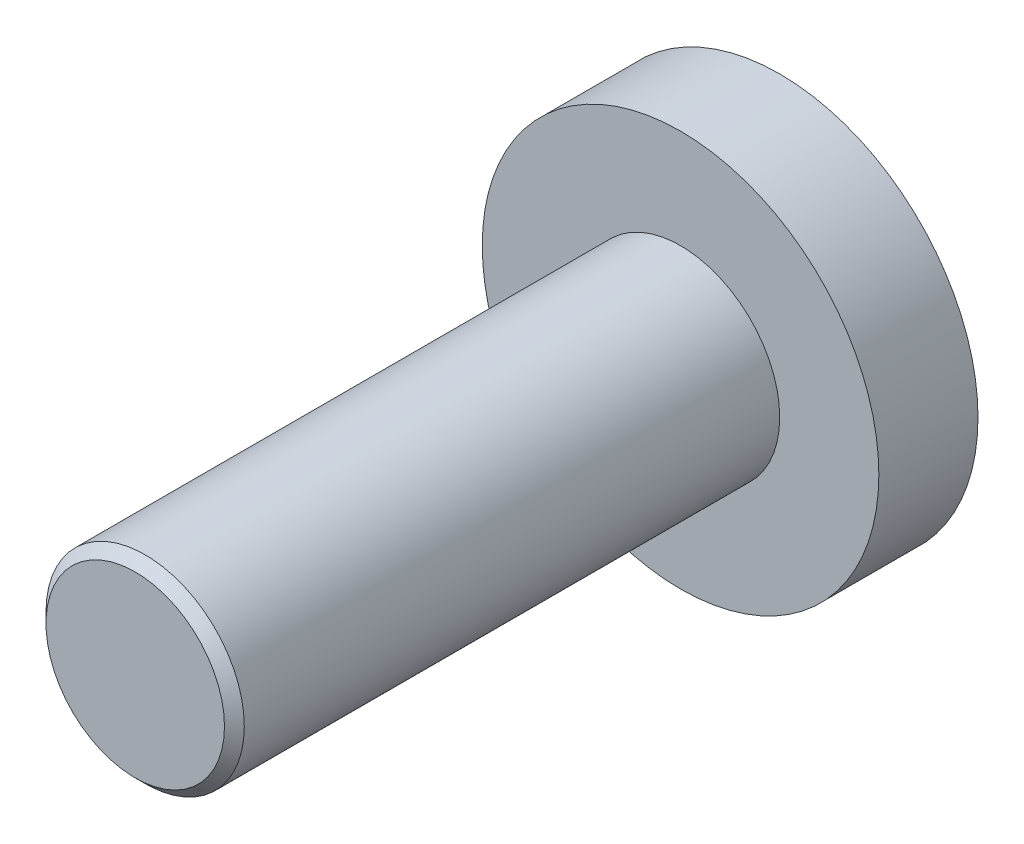
ISO-10303-21;
HEADER;
FILE_DESCRIPTION(('STEP AP214'),'2;1');
FILE_NAME('part.step','',(''),(''),'','','');
FILE_SCHEMA(('AUTOMOTIVE_DESIGN { 1 0 10303 214 1 1 1 1 }'));
ENDSEC;
DATA;
#1=APPLICATION_CONTEXT('core data for automotive mechanical design processes');
#2=APPLICATION_PROTOCOL_DEFINITION('international standard','automotive_design',2000,#1);
#3=PRODUCT_CONTEXT('',#1,'mechanical');
#4=PRODUCT('Part','Part','',(#3));
#5=PRODUCT_RELATED_PRODUCT_CATEGORY('part','',(#4));
#6=PRODUCT_DEFINITION_FORMATION('','',#4);
#7=PRODUCT_DEFINITION_CONTEXT('part definition',#1,'design');
#8=PRODUCT_DEFINITION('design','',#6,#7);
#9=PRODUCT_DEFINITION_SHAPE('','',#8);
#10=(LENGTH_UNIT() NAMED_UNIT(*) SI_UNIT(.MILLI.,.METRE.));
#11=(NAMED_UNIT(*) PLANE_ANGLE_UNIT() SI_UNIT($,.RADIAN.));
#12=(NAMED_UNIT(*) SI_UNIT($,.STERADIAN.) SOLID_ANGLE_UNIT());
#13=UNCERTAINTY_MEASURE_WITH_UNIT(LENGTH_MEASURE(1.E-05),#10,'distance_accuracy_value','');
#14=(GEOMETRIC_REPRESENTATION_CONTEXT(3) GLOBAL_UNCERTAINTY_ASSIGNED_CONTEXT((#13)) GLOBAL_UNIT_ASSIGNED_CONTEXT((#10,
#11,#12)) REPRESENTATION_CONTEXT('',''));
#15=CARTESIAN_POINT('',(0.,0.,0.));
#16=DIRECTION('',(0.,0.,1.));
#17=DIRECTION('',(1.,0.,0.));
#18=AXIS2_PLACEMENT_3D('',#15,#16,#17);
#19=CARTESIAN_POINT('',(0.,0.,11.));
#20=DIRECTION('',(0.,0.,-1.));
#21=DIRECTION('',(-1.,0.,0.));
#22=AXIS2_PLACEMENT_3D('',#19,#20,#21);
#23=CYLINDRICAL_SURFACE('',#22,2.);
#24=CARTESIAN_POINT('',(0.,0.,10.8));
#25=DIRECTION('',(0.,0.,1.));
#26=DIRECTION('',(1.,0.,0.));
#27=AXIS2_PLACEMENT_3D('',#24,#25,#26);
#28=CIRCLE('',#27,2.);
#29=CARTESIAN_POINT('',(2.,0.,10.8));
#30=VERTEX_POINT('',#29);
#31=EDGE_CURVE('E10',#30,#30,#28,.F.);
#32=ORIENTED_EDGE('',*,*,#31,.T.);
#33=EDGE_LOOP('',(#32));
#34=FACE_BOUND('',#33,.T.);
#35=CARTESIAN_POINT('',(0.,0.,0.));
#36=DIRECTION('',(0.,0.,-1.));
#37=DIRECTION('',(-1.,0.,0.));
#38=AXIS2_PLACEMENT_3D('',#35,#36,#37);
#39=CIRCLE('',#38,2.);
#40=CARTESIAN_POINT('',(-2.,0.,0.));
#41=VERTEX_POINT('',#40);
#42=EDGE_CURVE('E41',#41,#41,#39,.T.);
#43=ORIENTED_EDGE('',*,*,#42,.F.);
#44=EDGE_LOOP('',(#43));
#45=FACE_BOUND('',#44,.T.);
#46=ADVANCED_FACE('F30',(#34,#45),#23,.T.);
#47=CARTESIAN_POINT('',(0.,0.,11.));
#48=DIRECTION('',(0.,0.,1.));
#49=DIRECTION('',(1.,0.,0.));
#50=AXIS2_PLACEMENT_3D('',#47,#48,#49);
#51=PLANE('',#50);
#52=CARTESIAN_POINT('',(0.,0.,11.));
#53=DIRECTION('',(0.,0.,1.));
#54=DIRECTION('',(1.,0.,0.));
#55=AXIS2_PLACEMENT_3D('',#52,#53,#54);
#56=CIRCLE('',#55,1.8);
#57=CARTESIAN_POINT('',(1.8,0.,11.));
#58=VERTEX_POINT('',#57);
#59=EDGE_CURVE('E37',#58,#58,#56,.T.);
#60=ORIENTED_EDGE('',*,*,#59,.T.);
#61=EDGE_LOOP('',(#60));
#62=FACE_BOUND('',#61,.T.);
#63=ADVANCED_FACE('F65',(#62),#51,.T.);
#64=CARTESIAN_POINT('',(0.,0.,0.));
#65=DIRECTION('',(0.,0.,-1.));
#66=DIRECTION('',(-1.,0.,0.));
#67=AXIS2_PLACEMENT_3D('',#64,#65,#66);
#68=PLANE('',#67);
#69=CARTESIAN_POINT('',(0.,0.,0.));
#70=DIRECTION('',(0.,0.,-1.));
#71=DIRECTION('',(-1.,0.,0.));
#72=AXIS2_PLACEMENT_3D('',#69,#70,#71);
#73=CIRCLE('',#72,4.);
#74=CARTESIAN_POINT('',(-4.,0.,0.));
#75=VERTEX_POINT('',#74);
#76=EDGE_CURVE('E48',#75,#75,#73,.T.);
#77=ORIENTED_EDGE('',*,*,#76,.F.);
#78=EDGE_LOOP('',(#77));
#79=FACE_BOUND('',#78,.T.);
#80=ORIENTED_EDGE('',*,*,#42,.T.);
#81=EDGE_LOOP('',(#80));
#82=FACE_BOUND('',#81,.T.);
#83=ADVANCED_FACE('F59',(#79,#82),#68,.F.);
#84=CARTESIAN_POINT('',(0.,0.,-2.));
#85=DIRECTION('',(0.,0.,1.));
#86=DIRECTION('',(1.,0.,0.));
#87=AXIS2_PLACEMENT_3D('',#84,#85,#86);
#88=CYLINDRICAL_SURFACE('',#87,4.);
#89=CARTESIAN_POINT('',(0.,0.,-2.));
#90=DIRECTION('',(0.,0.,-1.));
#91=DIRECTION('',(-1.,0.,0.));
#92=AXIS2_PLACEMENT_3D('',#89,#90,#91);
#93=CIRCLE('',#92,4.);
#94=CARTESIAN_POINT('',(-4.,0.,-2.));
#95=VERTEX_POINT('',#94);
#96=EDGE_CURVE('E45',#95,#95,#93,.T.);
#97=ORIENTED_EDGE('',*,*,#96,.F.);
#98=EDGE_LOOP('',(#97));
#99=FACE_BOUND('',#98,.T.);
#100=ORIENTED_EDGE('',*,*,#76,.T.);
#101=EDGE_LOOP('',(#100));
#102=FACE_BOUND('',#101,.T.);
#103=ADVANCED_FACE('F56',(#99,#102),#88,.T.);
#104=CARTESIAN_POINT('',(0.,0.,-2.));
#105=DIRECTION('',(0.,0.,-1.));
#106=DIRECTION('',(-1.,0.,0.));
#107=AXIS2_PLACEMENT_3D('',#104,#105,#106);
#108=PLANE('',#107);
#109=ORIENTED_EDGE('',*,*,#96,.T.);
#110=EDGE_LOOP('',(#109));
#111=FACE_BOUND('',#110,.T.);
#112=ADVANCED_FACE('F54',(#111),#108,.T.);
#113=CARTESIAN_POINT('',(0.,0.,11.));
#114=DIRECTION('',(0.,0.,-1.));
#115=DIRECTION('',(-1.,0.,0.));
#116=AXIS2_PLACEMENT_3D('',#113,#114,#115);
#117=CONICAL_SURFACE('',#116,1.8,0.785398163397444);
#118=ORIENTED_EDGE('',*,*,#31,.F.);
#119=EDGE_LOOP('',(#118));
#120=FACE_BOUND('',#119,.T.);
#121=ORIENTED_EDGE('',*,*,#59,.F.);
#122=EDGE_LOOP('',(#121));
#123=FACE_BOUND('',#122,.T.);
#124=ADVANCED_FACE('F32',(#120,#123),#117,.T.);
#125=CLOSED_SHELL('',(#46,#63,#83,#103,#112,#124));
#126=MANIFOLD_SOLID_BREP('B2',#125);
#127=ADVANCED_BREP_SHAPE_REPRESENTATION('',(#18,#126),#14);
#128=SHAPE_DEFINITION_REPRESENTATION(#9,#127);
ENDSEC;
END-ISO-10303-21;
